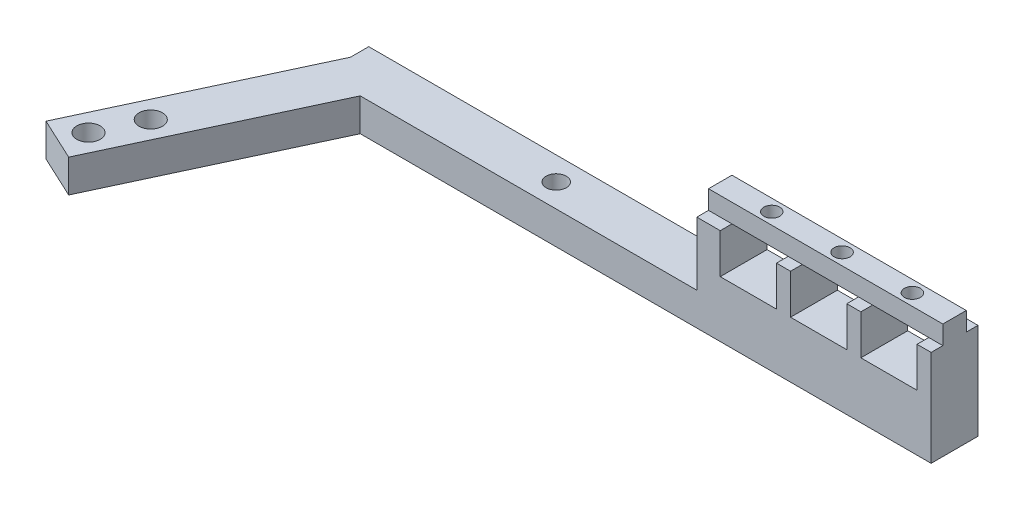
ISO-10303-21;
HEADER;
FILE_DESCRIPTION(('STEP AP214'),'2;1');
FILE_NAME('part.step','',(''),(''),'','','');
FILE_SCHEMA(('AUTOMOTIVE_DESIGN { 1 0 10303 214 1 1 1 1 }'));
ENDSEC;
DATA;
#1=APPLICATION_CONTEXT('core data for automotive mechanical design processes');
#2=APPLICATION_PROTOCOL_DEFINITION('international standard','automotive_design',2000,#1);
#3=PRODUCT_CONTEXT('',#1,'mechanical');
#4=PRODUCT('Part','Part','',(#3));
#5=PRODUCT_RELATED_PRODUCT_CATEGORY('part','',(#4));
#6=PRODUCT_DEFINITION_FORMATION('','',#4);
#7=PRODUCT_DEFINITION_CONTEXT('part definition',#1,'design');
#8=PRODUCT_DEFINITION('design','',#6,#7);
#9=PRODUCT_DEFINITION_SHAPE('','',#8);
#10=(LENGTH_UNIT() NAMED_UNIT(*) SI_UNIT(.MILLI.,.METRE.));
#11=(NAMED_UNIT(*) PLANE_ANGLE_UNIT() SI_UNIT($,.RADIAN.));
#12=(NAMED_UNIT(*) SI_UNIT($,.STERADIAN.) SOLID_ANGLE_UNIT());
#13=UNCERTAINTY_MEASURE_WITH_UNIT(LENGTH_MEASURE(1.E-05),#10,'distance_accuracy_value','');
#14=(GEOMETRIC_REPRESENTATION_CONTEXT(3) GLOBAL_UNCERTAINTY_ASSIGNED_CONTEXT((#13)) GLOBAL_UNIT_ASSIGNED_CONTEXT((#10,
#11,#12)) REPRESENTATION_CONTEXT('',''));
#15=CARTESIAN_POINT('',(0.,0.,0.));
#16=DIRECTION('',(0.,0.,1.));
#17=DIRECTION('',(1.,0.,0.));
#18=AXIS2_PLACEMENT_3D('',#15,#16,#17);
#19=CARTESIAN_POINT('',(0.,7.,10.));
#20=DIRECTION('',(0.,0.,-1.));
#21=DIRECTION('',(-1.,0.,0.));
#22=AXIS2_PLACEMENT_3D('',#19,#20,#21);
#23=PLANE('',#22);
#24=DIRECTION('',(1.,0.,0.));
#25=VECTOR('',#24,1.);
#26=CARTESIAN_POINT('',(0.,7.,10.));
#27=LINE('',#26,#25);
#28=CARTESIAN_POINT('',(8.18535130403744,7.,10.));
#29=VERTEX_POINT('',#28);
#30=CARTESIAN_POINT('',(80.,7.,10.));
#31=VERTEX_POINT('',#30);
#32=EDGE_CURVE('E77',#29,#31,#27,.T.);
#33=ORIENTED_EDGE('',*,*,#32,.F.);
#34=DIRECTION('',(0.,-1.,0.));
#35=VECTOR('',#34,1.);
#36=CARTESIAN_POINT('',(8.18535130403744,7.,10.));
#37=LINE('',#36,#35);
#38=CARTESIAN_POINT('',(8.18535130403744,0.,10.));
#39=VERTEX_POINT('',#38);
#40=EDGE_CURVE('E81',#29,#39,#37,.T.);
#41=ORIENTED_EDGE('',*,*,#40,.T.);
#42=DIRECTION('',(1.,0.,0.));
#43=VECTOR('',#42,1.);
#44=CARTESIAN_POINT('',(0.,0.,10.));
#45=LINE('',#44,#43);
#46=CARTESIAN_POINT('',(130.,0.,10.));
#47=VERTEX_POINT('',#46);
#48=EDGE_CURVE('E484',#39,#47,#45,.T.);
#49=ORIENTED_EDGE('',*,*,#48,.T.);
#50=DIRECTION('',(0.,-1.,0.));
#51=VECTOR('',#50,1.);
#52=CARTESIAN_POINT('',(130.,7.,10.));
#53=LINE('',#52,#51);
#54=CARTESIAN_POINT('',(130.,20.5,10.));
#55=VERTEX_POINT('',#54);
#56=EDGE_CURVE('E70',#55,#47,#53,.T.);
#57=ORIENTED_EDGE('',*,*,#56,.F.);
#58=DIRECTION('',(1.,0.,0.));
#59=VECTOR('',#58,1.);
#60=CARTESIAN_POINT('',(80.,20.5,10.));
#61=LINE('',#60,#59);
#62=CARTESIAN_POINT('',(127.,20.5,10.));
#63=VERTEX_POINT('',#62);
#64=EDGE_CURVE('E436',#63,#55,#61,.T.);
#65=ORIENTED_EDGE('',*,*,#64,.F.);
#66=DIRECTION('',(0.,1.,0.));
#67=VECTOR('',#66,1.);
#68=CARTESIAN_POINT('',(127.,0.,10.));
#69=LINE('',#68,#67);
#70=CARTESIAN_POINT('',(127.,12.,10.));
#71=VERTEX_POINT('',#70);
#72=EDGE_CURVE('E356',#71,#63,#69,.T.);
#73=ORIENTED_EDGE('',*,*,#72,.F.);
#74=DIRECTION('',(-1.,0.,0.));
#75=VECTOR('',#74,1.);
#76=CARTESIAN_POINT('',(0.,12.,10.));
#77=LINE('',#76,#75);
#78=CARTESIAN_POINT('',(115.,12.,10.));
#79=VERTEX_POINT('',#78);
#80=EDGE_CURVE('E364',#71,#79,#77,.T.);
#81=ORIENTED_EDGE('',*,*,#80,.T.);
#82=DIRECTION('',(0.,1.,0.));
#83=VECTOR('',#82,1.);
#84=CARTESIAN_POINT('',(115.,0.,10.));
#85=LINE('',#84,#83);
#86=CARTESIAN_POINT('',(115.,20.5,10.));
#87=VERTEX_POINT('',#86);
#88=EDGE_CURVE('E320',#79,#87,#85,.T.);
#89=ORIENTED_EDGE('',*,*,#88,.T.);
#90=CARTESIAN_POINT('',(112.,20.5,10.));
#91=VERTEX_POINT('',#90);
#92=EDGE_CURVE('E984',#91,#87,#61,.T.);
#93=ORIENTED_EDGE('',*,*,#92,.F.);
#94=DIRECTION('',(0.,1.,0.));
#95=VECTOR('',#94,1.);
#96=CARTESIAN_POINT('',(112.,0.,10.));
#97=LINE('',#96,#95);
#98=CARTESIAN_POINT('',(112.,12.,10.));
#99=VERTEX_POINT('',#98);
#100=EDGE_CURVE('E326',#99,#91,#97,.T.);
#101=ORIENTED_EDGE('',*,*,#100,.F.);
#102=DIRECTION('',(-1.,0.,0.));
#103=VECTOR('',#102,1.);
#104=CARTESIAN_POINT('',(0.,12.,10.));
#105=LINE('',#104,#103);
#106=CARTESIAN_POINT('',(100.,12.,10.));
#107=VERTEX_POINT('',#106);
#108=EDGE_CURVE('E335',#99,#107,#105,.T.);
#109=ORIENTED_EDGE('',*,*,#108,.T.);
#110=DIRECTION('',(0.,1.,0.));
#111=VECTOR('',#110,1.);
#112=CARTESIAN_POINT('',(100.,0.,10.));
#113=LINE('',#112,#111);
#114=CARTESIAN_POINT('',(100.,20.5,10.));
#115=VERTEX_POINT('',#114);
#116=EDGE_CURVE('E332',#107,#115,#113,.T.);
#117=ORIENTED_EDGE('',*,*,#116,.T.);
#118=CARTESIAN_POINT('',(97.,20.5,10.));
#119=VERTEX_POINT('',#118);
#120=EDGE_CURVE('E454',#119,#115,#61,.T.);
#121=ORIENTED_EDGE('',*,*,#120,.F.);
#122=DIRECTION('',(0.,1.,0.));
#123=VECTOR('',#122,1.);
#124=CARTESIAN_POINT('',(97.,0.,10.));
#125=LINE('',#124,#123);
#126=CARTESIAN_POINT('',(97.,12.,10.));
#127=VERTEX_POINT('',#126);
#128=EDGE_CURVE('E386',#127,#119,#125,.T.);
#129=ORIENTED_EDGE('',*,*,#128,.F.);
#130=DIRECTION('',(-1.,0.,0.));
#131=VECTOR('',#130,1.);
#132=CARTESIAN_POINT('',(0.,12.,10.));
#133=LINE('',#132,#131);
#134=CARTESIAN_POINT('',(85.,12.,10.));
#135=VERTEX_POINT('',#134);
#136=EDGE_CURVE('E394',#127,#135,#133,.T.);
#137=ORIENTED_EDGE('',*,*,#136,.T.);
#138=DIRECTION('',(0.,1.,0.));
#139=VECTOR('',#138,1.);
#140=CARTESIAN_POINT('',(85.,-1.24826662821612E-13,10.));
#141=LINE('',#140,#139);
#142=CARTESIAN_POINT('',(85.,20.5,10.));
#143=VERTEX_POINT('',#142);
#144=EDGE_CURVE('E382',#135,#143,#141,.T.);
#145=ORIENTED_EDGE('',*,*,#144,.T.);
#146=CARTESIAN_POINT('',(80.,20.5,10.));
#147=VERTEX_POINT('',#146);
#148=EDGE_CURVE('E442',#147,#143,#61,.T.);
#149=ORIENTED_EDGE('',*,*,#148,.F.);
#150=DIRECTION('',(0.,-1.,0.));
#151=VECTOR('',#150,1.);
#152=CARTESIAN_POINT('',(80.,45.5,10.));
#153=LINE('',#152,#151);
#154=EDGE_CURVE('E467',#147,#31,#153,.T.);
#155=ORIENTED_EDGE('',*,*,#154,.T.);
#156=EDGE_LOOP('',(#33,#41,#49,#57,#65,#73,#81,#89,#93,#101,#109,#117,#121,#129,#137,#145,#149,#155));
#157=FACE_BOUND('',#156,.T.);
#158=ADVANCED_FACE('F62',(#157),#23,.F.);
#159=CARTESIAN_POINT('',(0.,7.,0.));
#160=DIRECTION('',(0.,0.,1.));
#161=DIRECTION('',(1.,0.,0.));
#162=AXIS2_PLACEMENT_3D('',#159,#160,#161);
#163=PLANE('',#162);
#164=DIRECTION('',(0.,1.,0.));
#165=VECTOR('',#164,1.);
#166=CARTESIAN_POINT('',(100.,0.,0.));
#167=LINE('',#166,#165);
#168=CARTESIAN_POINT('',(100.,12.,0.));
#169=VERTEX_POINT('',#168);
#170=CARTESIAN_POINT('',(100.,20.5,0.));
#171=VERTEX_POINT('',#170);
#172=EDGE_CURVE('E323',#169,#171,#167,.T.);
#173=ORIENTED_EDGE('',*,*,#172,.F.);
#174=DIRECTION('',(-1.,0.,0.));
#175=VECTOR('',#174,1.);
#176=CARTESIAN_POINT('',(0.,12.,0.));
#177=LINE('',#176,#175);
#178=CARTESIAN_POINT('',(112.,12.,0.));
#179=VERTEX_POINT('',#178);
#180=EDGE_CURVE('E325',#179,#169,#177,.T.);
#181=ORIENTED_EDGE('',*,*,#180,.F.);
#182=DIRECTION('',(0.,1.,0.));
#183=VECTOR('',#182,1.);
#184=CARTESIAN_POINT('',(112.,0.,0.));
#185=LINE('',#184,#183);
#186=CARTESIAN_POINT('',(112.,20.5,0.));
#187=VERTEX_POINT('',#186);
#188=EDGE_CURVE('E328',#179,#187,#185,.T.);
#189=ORIENTED_EDGE('',*,*,#188,.T.);
#190=DIRECTION('',(-1.,0.,0.));
#191=VECTOR('',#190,1.);
#192=CARTESIAN_POINT('',(130.,20.5,0.));
#193=LINE('',#192,#191);
#194=CARTESIAN_POINT('',(115.,20.5,0.));
#195=VERTEX_POINT('',#194);
#196=EDGE_CURVE('E431',#195,#187,#193,.T.);
#197=ORIENTED_EDGE('',*,*,#196,.F.);
#198=DIRECTION('',(0.,1.,0.));
#199=VECTOR('',#198,1.);
#200=CARTESIAN_POINT('',(115.,0.,0.));
#201=LINE('',#200,#199);
#202=CARTESIAN_POINT('',(115.,12.,0.));
#203=VERTEX_POINT('',#202);
#204=EDGE_CURVE('E353',#203,#195,#201,.T.);
#205=ORIENTED_EDGE('',*,*,#204,.F.);
#206=DIRECTION('',(-1.,0.,0.));
#207=VECTOR('',#206,1.);
#208=CARTESIAN_POINT('',(0.,12.,0.));
#209=LINE('',#208,#207);
#210=CARTESIAN_POINT('',(127.,12.,0.));
#211=VERTEX_POINT('',#210);
#212=EDGE_CURVE('E355',#211,#203,#209,.T.);
#213=ORIENTED_EDGE('',*,*,#212,.F.);
#214=DIRECTION('',(0.,1.,0.));
#215=VECTOR('',#214,1.);
#216=CARTESIAN_POINT('',(127.,0.,0.));
#217=LINE('',#216,#215);
#218=CARTESIAN_POINT('',(127.,20.5,0.));
#219=VERTEX_POINT('',#218);
#220=EDGE_CURVE('E358',#211,#219,#217,.T.);
#221=ORIENTED_EDGE('',*,*,#220,.T.);
#222=CARTESIAN_POINT('',(130.,20.5,0.));
#223=VERTEX_POINT('',#222);
#224=EDGE_CURVE('E417',#223,#219,#193,.T.);
#225=ORIENTED_EDGE('',*,*,#224,.F.);
#226=DIRECTION('',(0.,-1.,0.));
#227=VECTOR('',#226,1.);
#228=CARTESIAN_POINT('',(130.,7.,0.));
#229=LINE('',#228,#227);
#230=CARTESIAN_POINT('',(130.,0.,0.));
#231=VERTEX_POINT('',#230);
#232=EDGE_CURVE('E492',#223,#231,#229,.T.);
#233=ORIENTED_EDGE('',*,*,#232,.T.);
#234=DIRECTION('',(-1.,0.,0.));
#235=VECTOR('',#234,1.);
#236=CARTESIAN_POINT('',(0.,0.,0.));
#237=LINE('',#236,#235);
#238=CARTESIAN_POINT('',(0.,0.,0.));
#239=VERTEX_POINT('',#238);
#240=EDGE_CURVE('E478',#231,#239,#237,.T.);
#241=ORIENTED_EDGE('',*,*,#240,.T.);
#242=DIRECTION('',(0.,-1.,0.));
#243=VECTOR('',#242,1.);
#244=CARTESIAN_POINT('',(0.,7.,0.));
#245=LINE('',#244,#243);
#246=CARTESIAN_POINT('',(0.,7.,0.));
#247=VERTEX_POINT('',#246);
#248=EDGE_CURVE('E482',#247,#239,#245,.T.);
#249=ORIENTED_EDGE('',*,*,#248,.F.);
#250=DIRECTION('',(-1.,0.,0.));
#251=VECTOR('',#250,1.);
#252=CARTESIAN_POINT('',(0.,7.,0.));
#253=LINE('',#252,#251);
#254=CARTESIAN_POINT('',(80.,7.,0.));
#255=VERTEX_POINT('',#254);
#256=EDGE_CURVE('E480',#255,#247,#253,.T.);
#257=ORIENTED_EDGE('',*,*,#256,.F.);
#258=DIRECTION('',(0.,-1.,0.));
#259=VECTOR('',#258,1.);
#260=CARTESIAN_POINT('',(80.,45.5,0.));
#261=LINE('',#260,#259);
#262=CARTESIAN_POINT('',(80.,20.5,0.));
#263=VERTEX_POINT('',#262);
#264=EDGE_CURVE('E465',#263,#255,#261,.T.);
#265=ORIENTED_EDGE('',*,*,#264,.F.);
#266=CARTESIAN_POINT('',(85.,20.5,0.));
#267=VERTEX_POINT('',#266);
#268=EDGE_CURVE('E412',#267,#263,#193,.T.);
#269=ORIENTED_EDGE('',*,*,#268,.F.);
#270=DIRECTION('',(0.,1.,0.));
#271=VECTOR('',#270,1.);
#272=CARTESIAN_POINT('',(85.,-1.24826662821612E-13,0.));
#273=LINE('',#272,#271);
#274=CARTESIAN_POINT('',(85.,12.,0.));
#275=VERTEX_POINT('',#274);
#276=EDGE_CURVE('E383',#275,#267,#273,.T.);
#277=ORIENTED_EDGE('',*,*,#276,.F.);
#278=DIRECTION('',(-1.,0.,0.));
#279=VECTOR('',#278,1.);
#280=CARTESIAN_POINT('',(0.,12.,0.));
#281=LINE('',#280,#279);
#282=CARTESIAN_POINT('',(97.,12.,0.));
#283=VERTEX_POINT('',#282);
#284=EDGE_CURVE('E385',#283,#275,#281,.T.);
#285=ORIENTED_EDGE('',*,*,#284,.F.);
#286=DIRECTION('',(0.,1.,0.));
#287=VECTOR('',#286,1.);
#288=CARTESIAN_POINT('',(97.,0.,0.));
#289=LINE('',#288,#287);
#290=CARTESIAN_POINT('',(97.,20.5,0.));
#291=VERTEX_POINT('',#290);
#292=EDGE_CURVE('E388',#283,#291,#289,.T.);
#293=ORIENTED_EDGE('',*,*,#292,.T.);
#294=EDGE_CURVE('E432',#171,#291,#193,.T.);
#295=ORIENTED_EDGE('',*,*,#294,.F.);
#296=EDGE_LOOP('',(#173,#181,#189,#197,#205,#213,#221,#225,#233,#241,#249,#257,#265,#269,#277,
#285,#293,#295));
#297=FACE_BOUND('',#296,.T.);
#298=ADVANCED_FACE('F509',(#297),#163,.F.);
#299=CARTESIAN_POINT('',(80.,20.5,7.5));
#300=DIRECTION('',(0.,-1.,0.));
#301=DIRECTION('',(0.,0.,-1.));
#302=AXIS2_PLACEMENT_3D('',#299,#300,#301);
#303=PLANE('',#302);
#304=DIRECTION('',(0.,0.,1.));
#305=VECTOR('',#304,1.);
#306=CARTESIAN_POINT('',(100.,20.5,0.));
#307=LINE('',#306,#305);
#308=CARTESIAN_POINT('',(100.,20.5,7.5));
#309=VERTEX_POINT('',#308);
#310=EDGE_CURVE('E344',#309,#115,#307,.T.);
#311=ORIENTED_EDGE('',*,*,#310,.F.);
#312=DIRECTION('',(1.,0.,0.));
#313=VECTOR('',#312,1.);
#314=CARTESIAN_POINT('',(80.,20.5,7.5));
#315=LINE('',#314,#313);
#316=CARTESIAN_POINT('',(97.,20.5,7.5));
#317=VERTEX_POINT('',#316);
#318=EDGE_CURVE('E447',#317,#309,#315,.T.);
#319=ORIENTED_EDGE('',*,*,#318,.F.);
#320=DIRECTION('',(0.,0.,1.));
#321=VECTOR('',#320,1.);
#322=CARTESIAN_POINT('',(97.,20.5,0.));
#323=LINE('',#322,#321);
#324=EDGE_CURVE('E407',#317,#119,#323,.T.);
#325=ORIENTED_EDGE('',*,*,#324,.T.);
#326=ORIENTED_EDGE('',*,*,#120,.T.);
#327=EDGE_LOOP('',(#311,#319,#325,#326));
#328=FACE_BOUND('',#327,.T.);
#329=ADVANCED_FACE('F534',(#328),#303,.F.);
#330=CARTESIAN_POINT('',(112.,20.5,7.5));
#331=VERTEX_POINT('',#330);
#332=CARTESIAN_POINT('',(115.,20.5,7.5));
#333=VERTEX_POINT('',#332);
#334=EDGE_CURVE('E932',#331,#333,#315,.T.);
#335=ORIENTED_EDGE('',*,*,#334,.F.);
#336=DIRECTION('',(0.,0.,1.));
#337=VECTOR('',#336,1.);
#338=CARTESIAN_POINT('',(112.,20.5,0.));
#339=LINE('',#338,#337);
#340=EDGE_CURVE('E349',#331,#91,#339,.T.);
#341=ORIENTED_EDGE('',*,*,#340,.T.);
#342=ORIENTED_EDGE('',*,*,#92,.T.);
#343=DIRECTION('',(0.,0.,1.));
#344=VECTOR('',#343,1.);
#345=CARTESIAN_POINT('',(115.,20.5,0.));
#346=LINE('',#345,#344);
#347=EDGE_CURVE('E370',#333,#87,#346,.T.);
#348=ORIENTED_EDGE('',*,*,#347,.F.);
#349=EDGE_LOOP('',(#335,#341,#342,#348));
#350=FACE_BOUND('',#349,.T.);
#351=ADVANCED_FACE('F856',(#350),#303,.F.);
#352=CARTESIAN_POINT('',(130.,20.5,2.5));
#353=DIRECTION('',(0.,-1.,0.));
#354=DIRECTION('',(0.,0.,-1.));
#355=AXIS2_PLACEMENT_3D('',#352,#353,#354);
#356=PLANE('',#355);
#357=CARTESIAN_POINT('',(100.,20.5,2.5));
#358=VERTEX_POINT('',#357);
#359=EDGE_CURVE('E340',#171,#358,#307,.T.);
#360=ORIENTED_EDGE('',*,*,#359,.F.);
#361=ORIENTED_EDGE('',*,*,#294,.T.);
#362=CARTESIAN_POINT('',(97.,20.5,2.5));
#363=VERTEX_POINT('',#362);
#364=EDGE_CURVE('E403',#291,#363,#323,.T.);
#365=ORIENTED_EDGE('',*,*,#364,.T.);
#366=DIRECTION('',(-1.,0.,0.));
#367=VECTOR('',#366,1.);
#368=CARTESIAN_POINT('',(130.,20.5,2.5));
#369=LINE('',#368,#367);
#370=EDGE_CURVE('E423',#358,#363,#369,.T.);
#371=ORIENTED_EDGE('',*,*,#370,.F.);
#372=EDGE_LOOP('',(#360,#361,#365,#371));
#373=FACE_BOUND('',#372,.T.);
#374=ADVANCED_FACE('F572',(#373),#356,.F.);
#375=ORIENTED_EDGE('',*,*,#196,.T.);
#376=CARTESIAN_POINT('',(112.,20.5,2.5));
#377=VERTEX_POINT('',#376);
#378=EDGE_CURVE('E345',#187,#377,#339,.T.);
#379=ORIENTED_EDGE('',*,*,#378,.T.);
#380=CARTESIAN_POINT('',(115.,20.5,2.5));
#381=VERTEX_POINT('',#380);
#382=EDGE_CURVE('E968',#381,#377,#369,.T.);
#383=ORIENTED_EDGE('',*,*,#382,.F.);
#384=EDGE_CURVE('E336',#195,#381,#346,.T.);
#385=ORIENTED_EDGE('',*,*,#384,.F.);
#386=EDGE_LOOP('',(#375,#379,#383,#385));
#387=FACE_BOUND('',#386,.T.);
#388=ADVANCED_FACE('F847',(#387),#356,.F.);
#389=DIRECTION('',(0.,0.,1.));
#390=VECTOR('',#389,1.);
#391=CARTESIAN_POINT('',(85.,20.5,0.));
#392=LINE('',#391,#390);
#393=CARTESIAN_POINT('',(85.,20.5,7.5));
#394=VERTEX_POINT('',#393);
#395=EDGE_CURVE('E402',#394,#143,#392,.T.);
#396=ORIENTED_EDGE('',*,*,#395,.F.);
#397=CARTESIAN_POINT('',(80.,20.5,7.5));
#398=VERTEX_POINT('',#397);
#399=EDGE_CURVE('E443',#398,#394,#315,.T.);
#400=ORIENTED_EDGE('',*,*,#399,.F.);
#401=DIRECTION('',(0.,0.,1.));
#402=VECTOR('',#401,1.);
#403=CARTESIAN_POINT('',(80.,20.5,7.5));
#404=LINE('',#403,#402);
#405=EDGE_CURVE('E451',#398,#147,#404,.T.);
#406=ORIENTED_EDGE('',*,*,#405,.T.);
#407=ORIENTED_EDGE('',*,*,#148,.T.);
#408=EDGE_LOOP('',(#396,#400,#406,#407));
#409=FACE_BOUND('',#408,.T.);
#410=ADVANCED_FACE('F563',(#409),#303,.F.);
#411=CARTESIAN_POINT('',(85.,20.5,2.5));
#412=VERTEX_POINT('',#411);
#413=EDGE_CURVE('E398',#267,#412,#392,.T.);
#414=ORIENTED_EDGE('',*,*,#413,.F.);
#415=ORIENTED_EDGE('',*,*,#268,.T.);
#416=DIRECTION('',(0.,0.,-1.));
#417=VECTOR('',#416,1.);
#418=CARTESIAN_POINT('',(80.,20.5,2.5));
#419=LINE('',#418,#417);
#420=CARTESIAN_POINT('',(80.,20.5,2.5));
#421=VERTEX_POINT('',#420);
#422=EDGE_CURVE('E433',#421,#263,#419,.T.);
#423=ORIENTED_EDGE('',*,*,#422,.F.);
#424=EDGE_CURVE('E416',#412,#421,#369,.T.);
#425=ORIENTED_EDGE('',*,*,#424,.F.);
#426=EDGE_LOOP('',(#414,#415,#423,#425));
#427=FACE_BOUND('',#426,.T.);
#428=ADVANCED_FACE('F557',(#427),#356,.F.);
#429=CARTESIAN_POINT('',(0.,24.5,10.));
#430=DIRECTION('',(0.,-1.,0.));
#431=DIRECTION('',(0.,0.,-1.));
#432=AXIS2_PLACEMENT_3D('',#429,#430,#431);
#433=PLANE('',#432);
#434=CARTESIAN_POINT('',(106.,24.5,5.));
#435=DIRECTION('',(0.,-1.,0.));
#436=DIRECTION('',(0.,0.,-1.));
#437=AXIS2_PLACEMENT_3D('',#434,#435,#436);
#438=CIRCLE('',#437,1.7);
#439=CARTESIAN_POINT('',(106.,24.5,3.3));
#440=VERTEX_POINT('',#439);
#441=EDGE_CURVE('E305',#440,#440,#438,.T.);
#442=ORIENTED_EDGE('',*,*,#441,.T.);
#443=EDGE_LOOP('',(#442));
#444=FACE_BOUND('',#443,.T.);
#445=CARTESIAN_POINT('',(91.,24.5,5.));
#446=DIRECTION('',(0.,-1.,0.));
#447=DIRECTION('',(0.,0.,-1.));
#448=AXIS2_PLACEMENT_3D('',#445,#446,#447);
#449=CIRCLE('',#448,1.7);
#450=CARTESIAN_POINT('',(91.,24.5,3.3));
#451=VERTEX_POINT('',#450);
#452=EDGE_CURVE('E312',#451,#451,#449,.T.);
#453=ORIENTED_EDGE('',*,*,#452,.T.);
#454=EDGE_LOOP('',(#453));
#455=FACE_BOUND('',#454,.T.);
#456=CARTESIAN_POINT('',(121.,24.5,5.));
#457=DIRECTION('',(0.,-1.,0.));
#458=DIRECTION('',(0.,0.,-1.));
#459=AXIS2_PLACEMENT_3D('',#456,#457,#458);
#460=CIRCLE('',#459,1.7);
#461=CARTESIAN_POINT('',(121.,24.5,3.3));
#462=VERTEX_POINT('',#461);
#463=EDGE_CURVE('E317',#462,#462,#460,.T.);
#464=ORIENTED_EDGE('',*,*,#463,.T.);
#465=EDGE_LOOP('',(#464));
#466=FACE_BOUND('',#465,.T.);
#467=DIRECTION('',(1.,0.,0.));
#468=VECTOR('',#467,1.);
#469=CARTESIAN_POINT('',(130.,24.5,2.5));
#470=LINE('',#469,#468);
#471=CARTESIAN_POINT('',(80.,24.5,2.5));
#472=VERTEX_POINT('',#471);
#473=CARTESIAN_POINT('',(130.,24.5,2.5));
#474=VERTEX_POINT('',#473);
#475=EDGE_CURVE('E426',#472,#474,#470,.T.);
#476=ORIENTED_EDGE('',*,*,#475,.F.);
#477=DIRECTION('',(0.,0.,-1.));
#478=VECTOR('',#477,1.);
#479=CARTESIAN_POINT('',(80.,24.5,10.));
#480=LINE('',#479,#478);
#481=CARTESIAN_POINT('',(80.,24.5,7.5));
#482=VERTEX_POINT('',#481);
#483=EDGE_CURVE('E12',#482,#472,#480,.T.);
#484=ORIENTED_EDGE('',*,*,#483,.F.);
#485=DIRECTION('',(-1.,0.,0.));
#486=VECTOR('',#485,1.);
#487=CARTESIAN_POINT('',(80.,24.5,7.5));
#488=LINE('',#487,#486);
#489=CARTESIAN_POINT('',(130.,24.5,7.5));
#490=VERTEX_POINT('',#489);
#491=EDGE_CURVE('E449',#490,#482,#488,.T.);
#492=ORIENTED_EDGE('',*,*,#491,.F.);
#493=DIRECTION('',(0.,0.,-1.));
#494=VECTOR('',#493,1.);
#495=CARTESIAN_POINT('',(130.,24.5,10.));
#496=LINE('',#495,#494);
#497=EDGE_CURVE('E458',#490,#474,#496,.T.);
#498=ORIENTED_EDGE('',*,*,#497,.T.);
#499=EDGE_LOOP('',(#476,#484,#492,#498));
#500=FACE_BOUND('',#499,.T.);
#501=ADVANCED_FACE('F545',(#444,#455,#466,#500),#433,.F.);
#502=CARTESIAN_POINT('',(0.,7.,0.));
#503=DIRECTION('',(0.,1.,0.));
#504=DIRECTION('',(0.,0.,1.));
#505=AXIS2_PLACEMENT_3D('',#502,#503,#504);
#506=PLANE('',#505);
#507=CARTESIAN_POINT('',(-9.79163916092465,7.,36.7207725462827));
#508=DIRECTION('',(0.,-1.,0.));
#509=DIRECTION('',(0.,0.,-1.));
#510=AXIS2_PLACEMENT_3D('',#507,#508,#509);
#511=CIRCLE('',#510,2.5);
#512=CARTESIAN_POINT('',(-9.79163916092465,7.,34.2207725462827));
#513=VERTEX_POINT('',#512);
#514=EDGE_CURVE('E649',#513,#513,#511,.T.);
#515=ORIENTED_EDGE('',*,*,#514,.T.);
#516=EDGE_LOOP('',(#515));
#517=FACE_BOUND('',#516,.T.);
#518=CARTESIAN_POINT('',(-14.0178217783317,7.,45.7838504166491));
#519=DIRECTION('',(0.,-1.,0.));
#520=DIRECTION('',(0.,0.,-1.));
#521=AXIS2_PLACEMENT_3D('',#518,#519,#520);
#522=CIRCLE('',#521,2.5);
#523=CARTESIAN_POINT('',(-14.0178217783317,7.,43.2838504166491));
#524=VERTEX_POINT('',#523);
#525=EDGE_CURVE('E297',#524,#524,#522,.T.);
#526=ORIENTED_EDGE('',*,*,#525,.T.);
#527=EDGE_LOOP('',(#526));
#528=FACE_BOUND('',#527,.T.);
#529=DIRECTION('',(-0.422618261740704,0.,0.906307787036648));
#530=VECTOR('',#529,1.);
#531=CARTESIAN_POINT('',(10.553619067197,7.,4.92123339228466));
#532=LINE('',#531,#530);
#533=CARTESIAN_POINT('',(-11.599374151852,7.,52.4284806605359));
#534=VERTEX_POINT('',#533);
#535=EDGE_CURVE('E269',#29,#534,#532,.T.);
#536=ORIENTED_EDGE('',*,*,#535,.F.);
#537=ORIENTED_EDGE('',*,*,#32,.T.);
#538=DIRECTION('',(0.,0.,1.));
#539=VECTOR('',#538,1.);
#540=CARTESIAN_POINT('',(80.,7.,10.));
#541=LINE('',#540,#539);
#542=EDGE_CURVE('E462',#255,#31,#541,.T.);
#543=ORIENTED_EDGE('',*,*,#542,.F.);
#544=ORIENTED_EDGE('',*,*,#256,.T.);
#545=DIRECTION('',(0.,0.,1.));
#546=VECTOR('',#545,1.);
#547=CARTESIAN_POINT('',(0.,7.,0.));
#548=LINE('',#547,#546);
#549=CARTESIAN_POINT('',(0.,7.,3.89152668678525));
#550=VERTEX_POINT('',#549);
#551=EDGE_CURVE('E476',#247,#550,#548,.T.);
#552=ORIENTED_EDGE('',*,*,#551,.T.);
#553=DIRECTION('',(0.422618261740704,0.,-0.906307787036648));
#554=VECTOR('',#553,1.);
#555=CARTESIAN_POINT('',(1.49054119683054,7.,0.695050774877606));
#556=LINE('',#555,#554);
#557=CARTESIAN_POINT('',(-20.6624520222184,7.,48.2022980431289));
#558=VERTEX_POINT('',#557);
#559=EDGE_CURVE('E272',#558,#550,#556,.T.);
#560=ORIENTED_EDGE('',*,*,#559,.F.);
#561=DIRECTION('',(0.90630778703665,0.,0.422618261740701));
#562=VECTOR('',#561,1.);
#563=CARTESIAN_POINT('',(-22.1529932190488,7.,47.5072472682514));
#564=LINE('',#563,#562);
#565=EDGE_CURVE('E264',#558,#534,#564,.T.);
#566=ORIENTED_EDGE('',*,*,#565,.T.);
#567=EDGE_LOOP('',(#536,#537,#543,#544,#552,#560,#566));
#568=FACE_BOUND('',#567,.T.);
#569=CARTESIAN_POINT('',(45.,7.,5.));
#570=DIRECTION('',(0.,1.,0.));
#571=DIRECTION('',(0.,0.,1.));
#572=AXIS2_PLACEMENT_3D('',#569,#570,#571);
#573=CIRCLE('',#572,2.15);
#574=CARTESIAN_POINT('',(45.,7.,7.15));
#575=VERTEX_POINT('',#574);
#576=EDGE_CURVE('E470',#575,#575,#573,.T.);
#577=ORIENTED_EDGE('',*,*,#576,.F.);
#578=EDGE_LOOP('',(#577));
#579=FACE_BOUND('',#578,.T.);
#580=ADVANCED_FACE('F266',(#517,#528,#568,#579),#506,.T.);
#581=CARTESIAN_POINT('',(0.,0.,0.));
#582=DIRECTION('',(0.,1.,0.));
#583=DIRECTION('',(0.,0.,1.));
#584=AXIS2_PLACEMENT_3D('',#581,#582,#583);
#585=PLANE('',#584);
#586=CARTESIAN_POINT('',(-9.79163916092465,0.,36.7207725462827));
#587=DIRECTION('',(0.,-1.,0.));
#588=DIRECTION('',(0.,0.,-1.));
#589=AXIS2_PLACEMENT_3D('',#586,#587,#588);
#590=CIRCLE('',#589,2.5);
#591=CARTESIAN_POINT('',(-9.79163916092465,0.,34.2207725462827));
#592=VERTEX_POINT('',#591);
#593=EDGE_CURVE('E651',#592,#592,#590,.T.);
#594=ORIENTED_EDGE('',*,*,#593,.F.);
#595=EDGE_LOOP('',(#594));
#596=FACE_BOUND('',#595,.T.);
#597=CARTESIAN_POINT('',(-14.0178217783317,0.,45.7838504166491));
#598=DIRECTION('',(0.,-1.,0.));
#599=DIRECTION('',(0.,0.,-1.));
#600=AXIS2_PLACEMENT_3D('',#597,#598,#599);
#601=CIRCLE('',#600,2.5);
#602=CARTESIAN_POINT('',(-14.0178217783317,0.,43.2838504166491));
#603=VERTEX_POINT('',#602);
#604=EDGE_CURVE('E291',#603,#603,#601,.T.);
#605=ORIENTED_EDGE('',*,*,#604,.F.);
#606=EDGE_LOOP('',(#605));
#607=FACE_BOUND('',#606,.T.);
#608=CARTESIAN_POINT('',(45.,0.,5.));
#609=DIRECTION('',(0.,1.,0.));
#610=DIRECTION('',(0.,0.,1.));
#611=AXIS2_PLACEMENT_3D('',#608,#609,#610);
#612=CIRCLE('',#611,2.15);
#613=CARTESIAN_POINT('',(45.,0.,7.15));
#614=VERTEX_POINT('',#613);
#615=EDGE_CURVE('E469',#614,#614,#612,.T.);
#616=ORIENTED_EDGE('',*,*,#615,.T.);
#617=EDGE_LOOP('',(#616));
#618=FACE_BOUND('',#617,.T.);
#619=ORIENTED_EDGE('',*,*,#48,.F.);
#620=DIRECTION('',(-0.422618261740704,0.,0.906307787036648));
#621=VECTOR('',#620,1.);
#622=CARTESIAN_POINT('',(10.553619067197,0.,4.92123339228466));
#623=LINE('',#622,#621);
#624=CARTESIAN_POINT('',(-11.599374151852,0.,52.4284806605359));
#625=VERTEX_POINT('',#624);
#626=EDGE_CURVE('E295',#39,#625,#623,.T.);
#627=ORIENTED_EDGE('',*,*,#626,.T.);
#628=DIRECTION('',(0.90630778703665,0.,0.422618261740701));
#629=VECTOR('',#628,1.);
#630=CARTESIAN_POINT('',(-22.1529932190488,0.,47.5072472682514));
#631=LINE('',#630,#629);
#632=CARTESIAN_POINT('',(-20.6624520222184,0.,48.2022980431289));
#633=VERTEX_POINT('',#632);
#634=EDGE_CURVE('E279',#633,#625,#631,.T.);
#635=ORIENTED_EDGE('',*,*,#634,.F.);
#636=DIRECTION('',(0.422618261740704,0.,-0.906307787036648));
#637=VECTOR('',#636,1.);
#638=CARTESIAN_POINT('',(1.49054119683054,0.,0.695050774877606));
#639=LINE('',#638,#637);
#640=CARTESIAN_POINT('',(0.,0.,3.89152668678525));
#641=VERTEX_POINT('',#640);
#642=EDGE_CURVE('E286',#633,#641,#639,.T.);
#643=ORIENTED_EDGE('',*,*,#642,.T.);
#644=DIRECTION('',(0.,0.,1.));
#645=VECTOR('',#644,1.);
#646=CARTESIAN_POINT('',(0.,0.,0.));
#647=LINE('',#646,#645);
#648=EDGE_CURVE('E473',#239,#641,#647,.T.);
#649=ORIENTED_EDGE('',*,*,#648,.F.);
#650=ORIENTED_EDGE('',*,*,#240,.F.);
#651=DIRECTION('',(0.,0.,-1.));
#652=VECTOR('',#651,1.);
#653=CARTESIAN_POINT('',(130.,0.,0.));
#654=LINE('',#653,#652);
#655=EDGE_CURVE('E486',#47,#231,#654,.T.);
#656=ORIENTED_EDGE('',*,*,#655,.F.);
#657=EDGE_LOOP('',(#619,#627,#635,#643,#649,#650,#656));
#658=FACE_BOUND('',#657,.T.);
#659=ADVANCED_FACE('F504',(#596,#607,#618,#658),#585,.F.);
#660=CARTESIAN_POINT('',(0.,7.,0.));
#661=DIRECTION('',(1.,0.,0.));
#662=DIRECTION('',(0.,0.,-1.));
#663=AXIS2_PLACEMENT_3D('',#660,#661,#662);
#664=PLANE('',#663);
#665=ORIENTED_EDGE('',*,*,#648,.T.);
#666=DIRECTION('',(0.,-1.,0.));
#667=VECTOR('',#666,1.);
#668=CARTESIAN_POINT('',(0.,7.,3.89152668678525));
#669=LINE('',#668,#667);
#670=EDGE_CURVE('E299',#550,#641,#669,.T.);
#671=ORIENTED_EDGE('',*,*,#670,.F.);
#672=ORIENTED_EDGE('',*,*,#551,.F.);
#673=ORIENTED_EDGE('',*,*,#248,.T.);
#674=EDGE_LOOP('',(#665,#671,#672,#673));
#675=FACE_BOUND('',#674,.T.);
#676=ADVANCED_FACE('F64',(#675),#664,.F.);
#677=CARTESIAN_POINT('',(130.,7.,0.));
#678=DIRECTION('',(-1.,0.,0.));
#679=DIRECTION('',(0.,0.,1.));
#680=AXIS2_PLACEMENT_3D('',#677,#678,#679);
#681=PLANE('',#680);
#682=ORIENTED_EDGE('',*,*,#232,.F.);
#683=DIRECTION('',(0.,0.,-1.));
#684=VECTOR('',#683,1.);
#685=CARTESIAN_POINT('',(130.,20.5,2.5));
#686=LINE('',#685,#684);
#687=CARTESIAN_POINT('',(130.,20.5,2.5));
#688=VERTEX_POINT('',#687);
#689=EDGE_CURVE('E428',#688,#223,#686,.T.);
#690=ORIENTED_EDGE('',*,*,#689,.F.);
#691=DIRECTION('',(0.,-1.,0.));
#692=VECTOR('',#691,1.);
#693=CARTESIAN_POINT('',(130.,24.5,2.5));
#694=LINE('',#693,#692);
#695=EDGE_CURVE('E413',#474,#688,#694,.T.);
#696=ORIENTED_EDGE('',*,*,#695,.F.);
#697=ORIENTED_EDGE('',*,*,#497,.F.);
#698=DIRECTION('',(0.,1.,0.));
#699=VECTOR('',#698,1.);
#700=CARTESIAN_POINT('',(130.,24.5,7.5));
#701=LINE('',#700,#699);
#702=CARTESIAN_POINT('',(130.,20.5,7.5));
#703=VERTEX_POINT('',#702);
#704=EDGE_CURVE('E446',#703,#490,#701,.T.);
#705=ORIENTED_EDGE('',*,*,#704,.F.);
#706=DIRECTION('',(0.,0.,1.));
#707=VECTOR('',#706,1.);
#708=CARTESIAN_POINT('',(130.,20.5,7.5));
#709=LINE('',#708,#707);
#710=EDGE_CURVE('E455',#703,#55,#709,.T.);
#711=ORIENTED_EDGE('',*,*,#710,.T.);
#712=ORIENTED_EDGE('',*,*,#56,.T.);
#713=ORIENTED_EDGE('',*,*,#655,.T.);
#714=EDGE_LOOP('',(#682,#690,#696,#697,#705,#711,#712,#713));
#715=FACE_BOUND('',#714,.T.);
#716=ADVANCED_FACE('F498',(#715),#681,.F.);
#717=CARTESIAN_POINT('',(45.,7.,5.));
#718=DIRECTION('',(0.,-1.,0.));
#719=DIRECTION('',(0.,0.,-1.));
#720=AXIS2_PLACEMENT_3D('',#717,#718,#719);
#721=CYLINDRICAL_SURFACE('',#720,2.15);
#722=ORIENTED_EDGE('',*,*,#576,.T.);
#723=EDGE_LOOP('',(#722));
#724=FACE_BOUND('',#723,.T.);
#725=ORIENTED_EDGE('',*,*,#615,.F.);
#726=EDGE_LOOP('',(#725));
#727=FACE_BOUND('',#726,.T.);
#728=ADVANCED_FACE('F538',(#724,#727),#721,.F.);
#729=CARTESIAN_POINT('',(80.,45.5,10.));
#730=DIRECTION('',(1.,0.,0.));
#731=DIRECTION('',(0.,0.,-1.));
#732=AXIS2_PLACEMENT_3D('',#729,#730,#731);
#733=PLANE('',#732);
#734=DIRECTION('',(0.,1.,0.));
#735=VECTOR('',#734,1.);
#736=CARTESIAN_POINT('',(80.,24.5,2.5));
#737=LINE('',#736,#735);
#738=EDGE_CURVE('E421',#421,#472,#737,.T.);
#739=ORIENTED_EDGE('',*,*,#738,.F.);
#740=ORIENTED_EDGE('',*,*,#422,.T.);
#741=ORIENTED_EDGE('',*,*,#264,.T.);
#742=ORIENTED_EDGE('',*,*,#542,.T.);
#743=ORIENTED_EDGE('',*,*,#154,.F.);
#744=ORIENTED_EDGE('',*,*,#405,.F.);
#745=DIRECTION('',(0.,-1.,0.));
#746=VECTOR('',#745,1.);
#747=CARTESIAN_POINT('',(80.,24.5,7.5));
#748=LINE('',#747,#746);
#749=EDGE_CURVE('E438',#482,#398,#748,.T.);
#750=ORIENTED_EDGE('',*,*,#749,.F.);
#751=ORIENTED_EDGE('',*,*,#483,.T.);
#752=EDGE_LOOP('',(#739,#740,#741,#742,#743,#744,#750,#751));
#753=FACE_BOUND('',#752,.T.);
#754=ADVANCED_FACE('F549',(#753),#733,.F.);
#755=CARTESIAN_POINT('',(127.,20.5,7.5));
#756=VERTEX_POINT('',#755);
#757=EDGE_CURVE('E441',#756,#703,#315,.T.);
#758=ORIENTED_EDGE('',*,*,#757,.F.);
#759=DIRECTION('',(0.,0.,1.));
#760=VECTOR('',#759,1.);
#761=CARTESIAN_POINT('',(127.,20.5,0.));
#762=LINE('',#761,#760);
#763=EDGE_CURVE('E375',#756,#63,#762,.T.);
#764=ORIENTED_EDGE('',*,*,#763,.T.);
#765=ORIENTED_EDGE('',*,*,#64,.T.);
#766=ORIENTED_EDGE('',*,*,#710,.F.);
#767=EDGE_LOOP('',(#758,#764,#765,#766));
#768=FACE_BOUND('',#767,.T.);
#769=ADVANCED_FACE('F553',(#768),#303,.F.);
#770=CARTESIAN_POINT('',(0.,0.,7.5));
#771=DIRECTION('',(0.,0.,1.));
#772=DIRECTION('',(1.,0.,0.));
#773=AXIS2_PLACEMENT_3D('',#770,#771,#772);
#774=PLANE('',#773);
#775=ORIENTED_EDGE('',*,*,#749,.T.);
#776=ORIENTED_EDGE('',*,*,#399,.T.);
#777=DIRECTION('',(-1.,0.,0.));
#778=VECTOR('',#777,1.);
#779=CARTESIAN_POINT('',(0.,20.5,7.5));
#780=LINE('',#779,#778);
#781=EDGE_CURVE('E400',#317,#394,#780,.T.);
#782=ORIENTED_EDGE('',*,*,#781,.F.);
#783=ORIENTED_EDGE('',*,*,#318,.T.);
#784=DIRECTION('',(-1.,0.,0.));
#785=VECTOR('',#784,1.);
#786=CARTESIAN_POINT('',(0.,20.5,7.5));
#787=LINE('',#786,#785);
#788=EDGE_CURVE('E380',#331,#309,#787,.T.);
#789=ORIENTED_EDGE('',*,*,#788,.F.);
#790=ORIENTED_EDGE('',*,*,#334,.T.);
#791=DIRECTION('',(-1.,0.,0.));
#792=VECTOR('',#791,1.);
#793=CARTESIAN_POINT('',(0.,20.5,7.5));
#794=LINE('',#793,#792);
#795=EDGE_CURVE('E342',#756,#333,#794,.T.);
#796=ORIENTED_EDGE('',*,*,#795,.F.);
#797=ORIENTED_EDGE('',*,*,#757,.T.);
#798=ORIENTED_EDGE('',*,*,#704,.T.);
#799=ORIENTED_EDGE('',*,*,#491,.T.);
#800=EDGE_LOOP('',(#775,#776,#782,#783,#789,#790,#796,#797,#798,#799));
#801=FACE_BOUND('',#800,.T.);
#802=ADVANCED_FACE('F561',(#801),#774,.T.);
#803=ORIENTED_EDGE('',*,*,#224,.T.);
#804=CARTESIAN_POINT('',(127.,20.5,2.5));
#805=VERTEX_POINT('',#804);
#806=EDGE_CURVE('E371',#219,#805,#762,.T.);
#807=ORIENTED_EDGE('',*,*,#806,.T.);
#808=EDGE_CURVE('E418',#688,#805,#369,.T.);
#809=ORIENTED_EDGE('',*,*,#808,.F.);
#810=ORIENTED_EDGE('',*,*,#689,.T.);
#811=EDGE_LOOP('',(#803,#807,#809,#810));
#812=FACE_BOUND('',#811,.T.);
#813=ADVANCED_FACE('F566',(#812),#356,.F.);
#814=CARTESIAN_POINT('',(0.,0.,2.5));
#815=DIRECTION('',(0.,0.,-1.));
#816=DIRECTION('',(-1.,0.,0.));
#817=AXIS2_PLACEMENT_3D('',#814,#815,#816);
#818=PLANE('',#817);
#819=ORIENTED_EDGE('',*,*,#695,.T.);
#820=ORIENTED_EDGE('',*,*,#808,.T.);
#821=EDGE_CURVE('E422',#805,#381,#369,.T.);
#822=ORIENTED_EDGE('',*,*,#821,.T.);
#823=ORIENTED_EDGE('',*,*,#382,.T.);
#824=EDGE_CURVE('E967',#377,#358,#369,.T.);
#825=ORIENTED_EDGE('',*,*,#824,.T.);
#826=ORIENTED_EDGE('',*,*,#370,.T.);
#827=EDGE_CURVE('E424',#363,#412,#369,.T.);
#828=ORIENTED_EDGE('',*,*,#827,.T.);
#829=ORIENTED_EDGE('',*,*,#424,.T.);
#830=ORIENTED_EDGE('',*,*,#738,.T.);
#831=ORIENTED_EDGE('',*,*,#475,.T.);
#832=EDGE_LOOP('',(#819,#820,#822,#823,#825,#826,#828,#829,#830,#831));
#833=FACE_BOUND('',#832,.T.);
#834=ADVANCED_FACE('F570',(#833),#818,.T.);
#835=CARTESIAN_POINT('',(85.,-1.24826662821612E-13,0.));
#836=DIRECTION('',(1.,0.,0.));
#837=DIRECTION('',(0.,1.,0.));
#838=AXIS2_PLACEMENT_3D('',#835,#836,#837);
#839=PLANE('',#838);
#840=ORIENTED_EDGE('',*,*,#144,.F.);
#841=DIRECTION('',(0.,0.,1.));
#842=VECTOR('',#841,1.);
#843=CARTESIAN_POINT('',(85.,12.,0.));
#844=LINE('',#843,#842);
#845=EDGE_CURVE('E391',#275,#135,#844,.T.);
#846=ORIENTED_EDGE('',*,*,#845,.F.);
#847=ORIENTED_EDGE('',*,*,#276,.T.);
#848=ORIENTED_EDGE('',*,*,#413,.T.);
#849=EDGE_CURVE('E401',#412,#394,#392,.T.);
#850=ORIENTED_EDGE('',*,*,#849,.T.);
#851=ORIENTED_EDGE('',*,*,#395,.T.);
#852=EDGE_LOOP('',(#840,#846,#847,#848,#850,#851));
#853=FACE_BOUND('',#852,.T.);
#854=ADVANCED_FACE('F575',(#853),#839,.T.);
#855=CARTESIAN_POINT('',(0.,20.5,0.));
#856=DIRECTION('',(0.,1.,0.));
#857=DIRECTION('',(0.,0.,1.));
#858=AXIS2_PLACEMENT_3D('',#855,#856,#857);
#859=PLANE('',#858);
#860=CARTESIAN_POINT('',(91.,20.5,5.));
#861=DIRECTION('',(0.,-1.,0.));
#862=DIRECTION('',(0.,0.,-1.));
#863=AXIS2_PLACEMENT_3D('',#860,#861,#862);
#864=CIRCLE('',#863,1.7);
#865=CARTESIAN_POINT('',(91.,20.5,3.3));
#866=VERTEX_POINT('',#865);
#867=EDGE_CURVE('E302',#866,#866,#864,.T.);
#868=ORIENTED_EDGE('',*,*,#867,.F.);
#869=EDGE_LOOP('',(#868));
#870=FACE_BOUND('',#869,.T.);
#871=ORIENTED_EDGE('',*,*,#781,.T.);
#872=ORIENTED_EDGE('',*,*,#849,.F.);
#873=ORIENTED_EDGE('',*,*,#827,.F.);
#874=EDGE_CURVE('E406',#363,#317,#323,.T.);
#875=ORIENTED_EDGE('',*,*,#874,.T.);
#876=EDGE_LOOP('',(#871,#872,#873,#875));
#877=FACE_BOUND('',#876,.T.);
#878=ADVANCED_FACE('F579',(#870,#877),#859,.F.);
#879=CARTESIAN_POINT('',(97.,0.,0.));
#880=DIRECTION('',(1.,0.,0.));
#881=DIRECTION('',(0.,0.,-1.));
#882=AXIS2_PLACEMENT_3D('',#879,#880,#881);
#883=PLANE('',#882);
#884=ORIENTED_EDGE('',*,*,#128,.T.);
#885=ORIENTED_EDGE('',*,*,#324,.F.);
#886=ORIENTED_EDGE('',*,*,#874,.F.);
#887=ORIENTED_EDGE('',*,*,#364,.F.);
#888=ORIENTED_EDGE('',*,*,#292,.F.);
#889=DIRECTION('',(0.,0.,1.));
#890=VECTOR('',#889,1.);
#891=CARTESIAN_POINT('',(97.,12.,0.));
#892=LINE('',#891,#890);
#893=EDGE_CURVE('E408',#283,#127,#892,.T.);
#894=ORIENTED_EDGE('',*,*,#893,.T.);
#895=EDGE_LOOP('',(#884,#885,#886,#887,#888,#894));
#896=FACE_BOUND('',#895,.T.);
#897=ADVANCED_FACE('F585',(#896),#883,.F.);
#898=CARTESIAN_POINT('',(0.,12.,0.));
#899=DIRECTION('',(0.,1.,0.));
#900=DIRECTION('',(-1.,0.,0.));
#901=AXIS2_PLACEMENT_3D('',#898,#899,#900);
#902=PLANE('',#901);
#903=ORIENTED_EDGE('',*,*,#136,.F.);
#904=ORIENTED_EDGE('',*,*,#893,.F.);
#905=ORIENTED_EDGE('',*,*,#284,.T.);
#906=ORIENTED_EDGE('',*,*,#845,.T.);
#907=EDGE_LOOP('',(#903,#904,#905,#906));
#908=FACE_BOUND('',#907,.T.);
#909=ADVANCED_FACE('F581',(#908),#902,.T.);
#910=CARTESIAN_POINT('',(115.,0.,0.));
#911=DIRECTION('',(1.,0.,0.));
#912=DIRECTION('',(0.,0.,-1.));
#913=AXIS2_PLACEMENT_3D('',#910,#911,#912);
#914=PLANE('',#913);
#915=ORIENTED_EDGE('',*,*,#88,.F.);
#916=DIRECTION('',(0.,0.,1.));
#917=VECTOR('',#916,1.);
#918=CARTESIAN_POINT('',(115.,12.,0.));
#919=LINE('',#918,#917);
#920=EDGE_CURVE('E361',#203,#79,#919,.T.);
#921=ORIENTED_EDGE('',*,*,#920,.F.);
#922=ORIENTED_EDGE('',*,*,#204,.T.);
#923=ORIENTED_EDGE('',*,*,#384,.T.);
#924=EDGE_CURVE('E369',#381,#333,#346,.T.);
#925=ORIENTED_EDGE('',*,*,#924,.T.);
#926=ORIENTED_EDGE('',*,*,#347,.T.);
#927=EDGE_LOOP('',(#915,#921,#922,#923,#925,#926));
#928=FACE_BOUND('',#927,.T.);
#929=ADVANCED_FACE('F584',(#928),#914,.T.);
#930=CARTESIAN_POINT('',(0.,20.5,0.));
#931=DIRECTION('',(0.,1.,0.));
#932=DIRECTION('',(0.,0.,1.));
#933=AXIS2_PLACEMENT_3D('',#930,#931,#932);
#934=PLANE('',#933);
#935=CARTESIAN_POINT('',(121.,20.5,5.));
#936=DIRECTION('',(0.,-1.,0.));
#937=DIRECTION('',(0.,0.,-1.));
#938=AXIS2_PLACEMENT_3D('',#935,#936,#937);
#939=CIRCLE('',#938,1.7);
#940=CARTESIAN_POINT('',(121.,20.5,3.3));
#941=VERTEX_POINT('',#940);
#942=EDGE_CURVE('E308',#941,#941,#939,.T.);
#943=ORIENTED_EDGE('',*,*,#942,.F.);
#944=EDGE_LOOP('',(#943));
#945=FACE_BOUND('',#944,.T.);
#946=ORIENTED_EDGE('',*,*,#795,.T.);
#947=ORIENTED_EDGE('',*,*,#924,.F.);
#948=ORIENTED_EDGE('',*,*,#821,.F.);
#949=EDGE_CURVE('E374',#805,#756,#762,.T.);
#950=ORIENTED_EDGE('',*,*,#949,.T.);
#951=EDGE_LOOP('',(#946,#947,#948,#950));
#952=FACE_BOUND('',#951,.T.);
#953=ADVANCED_FACE('F595',(#945,#952),#934,.F.);
#954=CARTESIAN_POINT('',(127.,0.,0.));
#955=DIRECTION('',(1.,0.,0.));
#956=DIRECTION('',(0.,0.,-1.));
#957=AXIS2_PLACEMENT_3D('',#954,#955,#956);
#958=PLANE('',#957);
#959=ORIENTED_EDGE('',*,*,#72,.T.);
#960=ORIENTED_EDGE('',*,*,#763,.F.);
#961=ORIENTED_EDGE('',*,*,#949,.F.);
#962=ORIENTED_EDGE('',*,*,#806,.F.);
#963=ORIENTED_EDGE('',*,*,#220,.F.);
#964=DIRECTION('',(0.,0.,1.));
#965=VECTOR('',#964,1.);
#966=CARTESIAN_POINT('',(127.,12.,0.));
#967=LINE('',#966,#965);
#968=EDGE_CURVE('E376',#211,#71,#967,.T.);
#969=ORIENTED_EDGE('',*,*,#968,.T.);
#970=EDGE_LOOP('',(#959,#960,#961,#962,#963,#969));
#971=FACE_BOUND('',#970,.T.);
#972=ADVANCED_FACE('F601',(#971),#958,.F.);
#973=CARTESIAN_POINT('',(0.,12.,0.));
#974=DIRECTION('',(0.,1.,0.));
#975=DIRECTION('',(-1.,0.,0.));
#976=AXIS2_PLACEMENT_3D('',#973,#974,#975);
#977=PLANE('',#976);
#978=ORIENTED_EDGE('',*,*,#80,.F.);
#979=ORIENTED_EDGE('',*,*,#968,.F.);
#980=ORIENTED_EDGE('',*,*,#212,.T.);
#981=ORIENTED_EDGE('',*,*,#920,.T.);
#982=EDGE_LOOP('',(#978,#979,#980,#981));
#983=FACE_BOUND('',#982,.T.);
#984=ADVANCED_FACE('F597',(#983),#977,.T.);
#985=CARTESIAN_POINT('',(100.,0.,0.));
#986=DIRECTION('',(1.,0.,0.));
#987=DIRECTION('',(0.,0.,-1.));
#988=AXIS2_PLACEMENT_3D('',#985,#986,#987);
#989=PLANE('',#988);
#990=ORIENTED_EDGE('',*,*,#116,.F.);
#991=DIRECTION('',(0.,0.,1.));
#992=VECTOR('',#991,1.);
#993=CARTESIAN_POINT('',(100.,12.,0.));
#994=LINE('',#993,#992);
#995=EDGE_CURVE('E331',#169,#107,#994,.T.);
#996=ORIENTED_EDGE('',*,*,#995,.F.);
#997=ORIENTED_EDGE('',*,*,#172,.T.);
#998=ORIENTED_EDGE('',*,*,#359,.T.);
#999=EDGE_CURVE('E343',#358,#309,#307,.T.);
#1000=ORIENTED_EDGE('',*,*,#999,.T.);
#1001=ORIENTED_EDGE('',*,*,#310,.T.);
#1002=EDGE_LOOP('',(#990,#996,#997,#998,#1000,#1001));
#1003=FACE_BOUND('',#1002,.T.);
#1004=ADVANCED_FACE('F600',(#1003),#989,.T.);
#1005=CARTESIAN_POINT('',(0.,20.5,0.));
#1006=DIRECTION('',(0.,1.,0.));
#1007=DIRECTION('',(0.,0.,1.));
#1008=AXIS2_PLACEMENT_3D('',#1005,#1006,#1007);
#1009=PLANE('',#1008);
#1010=CARTESIAN_POINT('',(106.,20.5,5.));
#1011=DIRECTION('',(0.,-1.,0.));
#1012=DIRECTION('',(0.,0.,-1.));
#1013=AXIS2_PLACEMENT_3D('',#1010,#1011,#1012);
#1014=CIRCLE('',#1013,1.7);
#1015=CARTESIAN_POINT('',(106.,20.5,3.3));
#1016=VERTEX_POINT('',#1015);
#1017=EDGE_CURVE('E309',#1016,#1016,#1014,.T.);
#1018=ORIENTED_EDGE('',*,*,#1017,.F.);
#1019=EDGE_LOOP('',(#1018));
#1020=FACE_BOUND('',#1019,.T.);
#1021=ORIENTED_EDGE('',*,*,#788,.T.);
#1022=ORIENTED_EDGE('',*,*,#999,.F.);
#1023=ORIENTED_EDGE('',*,*,#824,.F.);
#1024=EDGE_CURVE('E348',#377,#331,#339,.T.);
#1025=ORIENTED_EDGE('',*,*,#1024,.T.);
#1026=EDGE_LOOP('',(#1021,#1022,#1023,#1025));
#1027=FACE_BOUND('',#1026,.T.);
#1028=ADVANCED_FACE('F611',(#1020,#1027),#1009,.F.);
#1029=CARTESIAN_POINT('',(112.,0.,0.));
#1030=DIRECTION('',(1.,0.,0.));
#1031=DIRECTION('',(0.,0.,-1.));
#1032=AXIS2_PLACEMENT_3D('',#1029,#1030,#1031);
#1033=PLANE('',#1032);
#1034=ORIENTED_EDGE('',*,*,#100,.T.);
#1035=ORIENTED_EDGE('',*,*,#340,.F.);
#1036=ORIENTED_EDGE('',*,*,#1024,.F.);
#1037=ORIENTED_EDGE('',*,*,#378,.F.);
#1038=ORIENTED_EDGE('',*,*,#188,.F.);
#1039=DIRECTION('',(0.,0.,1.));
#1040=VECTOR('',#1039,1.);
#1041=CARTESIAN_POINT('',(112.,12.,0.));
#1042=LINE('',#1041,#1040);
#1043=EDGE_CURVE('E350',#179,#99,#1042,.T.);
#1044=ORIENTED_EDGE('',*,*,#1043,.T.);
#1045=EDGE_LOOP('',(#1034,#1035,#1036,#1037,#1038,#1044));
#1046=FACE_BOUND('',#1045,.T.);
#1047=ADVANCED_FACE('F617',(#1046),#1033,.F.);
#1048=CARTESIAN_POINT('',(0.,12.,0.));
#1049=DIRECTION('',(0.,1.,0.));
#1050=DIRECTION('',(-1.,0.,0.));
#1051=AXIS2_PLACEMENT_3D('',#1048,#1049,#1050);
#1052=PLANE('',#1051);
#1053=ORIENTED_EDGE('',*,*,#108,.F.);
#1054=ORIENTED_EDGE('',*,*,#1043,.F.);
#1055=ORIENTED_EDGE('',*,*,#180,.T.);
#1056=ORIENTED_EDGE('',*,*,#995,.T.);
#1057=EDGE_LOOP('',(#1053,#1054,#1055,#1056));
#1058=FACE_BOUND('',#1057,.T.);
#1059=ADVANCED_FACE('F613',(#1058),#1052,.T.);
#1060=CARTESIAN_POINT('',(121.,24.5,5.));
#1061=DIRECTION('',(0.,-1.,0.));
#1062=DIRECTION('',(0.,0.,-1.));
#1063=AXIS2_PLACEMENT_3D('',#1060,#1061,#1062);
#1064=CYLINDRICAL_SURFACE('',#1063,1.7);
#1065=ORIENTED_EDGE('',*,*,#463,.F.);
#1066=EDGE_LOOP('',(#1065));
#1067=FACE_BOUND('',#1066,.T.);
#1068=ORIENTED_EDGE('',*,*,#942,.T.);
#1069=EDGE_LOOP('',(#1068));
#1070=FACE_BOUND('',#1069,.T.);
#1071=ADVANCED_FACE('F616',(#1067,#1070),#1064,.F.);
#1072=CARTESIAN_POINT('',(106.,24.5,5.));
#1073=DIRECTION('',(0.,-1.,0.));
#1074=DIRECTION('',(0.,0.,-1.));
#1075=AXIS2_PLACEMENT_3D('',#1072,#1073,#1074);
#1076=CYLINDRICAL_SURFACE('',#1075,1.7);
#1077=ORIENTED_EDGE('',*,*,#441,.F.);
#1078=EDGE_LOOP('',(#1077));
#1079=FACE_BOUND('',#1078,.T.);
#1080=ORIENTED_EDGE('',*,*,#1017,.T.);
#1081=EDGE_LOOP('',(#1080));
#1082=FACE_BOUND('',#1081,.T.);
#1083=ADVANCED_FACE('F526',(#1079,#1082),#1076,.F.);
#1084=CARTESIAN_POINT('',(91.,24.5,5.));
#1085=DIRECTION('',(0.,-1.,0.));
#1086=DIRECTION('',(0.,0.,-1.));
#1087=AXIS2_PLACEMENT_3D('',#1084,#1085,#1086);
#1088=CYLINDRICAL_SURFACE('',#1087,1.7);
#1089=ORIENTED_EDGE('',*,*,#452,.F.);
#1090=EDGE_LOOP('',(#1089));
#1091=FACE_BOUND('',#1090,.T.);
#1092=ORIENTED_EDGE('',*,*,#867,.T.);
#1093=EDGE_LOOP('',(#1092));
#1094=FACE_BOUND('',#1093,.T.);
#1095=ADVANCED_FACE('F519',(#1091,#1094),#1088,.F.);
#1096=CARTESIAN_POINT('',(1.49054119683054,7.,0.695050774877606));
#1097=DIRECTION('',(-0.906307787036648,0.,-0.422618261740704));
#1098=DIRECTION('',(-0.422618261740704,0.,0.906307787036648));
#1099=AXIS2_PLACEMENT_3D('',#1096,#1097,#1098);
#1100=PLANE('',#1099);
#1101=ORIENTED_EDGE('',*,*,#642,.F.);
#1102=DIRECTION('',(0.,-1.,0.));
#1103=VECTOR('',#1102,1.);
#1104=CARTESIAN_POINT('',(-20.6624520222184,7.,48.2022980431289));
#1105=LINE('',#1104,#1103);
#1106=EDGE_CURVE('E283',#558,#633,#1105,.T.);
#1107=ORIENTED_EDGE('',*,*,#1106,.F.);
#1108=ORIENTED_EDGE('',*,*,#559,.T.);
#1109=ORIENTED_EDGE('',*,*,#670,.T.);
#1110=EDGE_LOOP('',(#1101,#1107,#1108,#1109));
#1111=FACE_BOUND('',#1110,.T.);
#1112=ADVANCED_FACE('F517',(#1111),#1100,.T.);
#1113=CARTESIAN_POINT('',(-22.1529932190488,7.,47.5072472682514));
#1114=DIRECTION('',(0.422618261740701,0.,-0.906307787036649));
#1115=DIRECTION('',(-0.90630778703665,0.,-0.422618261740701));
#1116=AXIS2_PLACEMENT_3D('',#1113,#1114,#1115);
#1117=PLANE('',#1116);
#1118=ORIENTED_EDGE('',*,*,#634,.T.);
#1119=DIRECTION('',(0.,-1.,0.));
#1120=VECTOR('',#1119,1.);
#1121=CARTESIAN_POINT('',(-11.599374151852,7.,52.4284806605359));
#1122=LINE('',#1121,#1120);
#1123=EDGE_CURVE('E276',#534,#625,#1122,.T.);
#1124=ORIENTED_EDGE('',*,*,#1123,.F.);
#1125=ORIENTED_EDGE('',*,*,#565,.F.);
#1126=ORIENTED_EDGE('',*,*,#1106,.T.);
#1127=EDGE_LOOP('',(#1118,#1124,#1125,#1126));
#1128=FACE_BOUND('',#1127,.T.);
#1129=ADVANCED_FACE('F277',(#1128),#1117,.F.);
#1130=CARTESIAN_POINT('',(10.553619067197,7.,4.92123339228466));
#1131=DIRECTION('',(0.906307787036648,0.,0.422618261740704));
#1132=DIRECTION('',(0.422618261740704,0.,-0.906307787036648));
#1133=AXIS2_PLACEMENT_3D('',#1130,#1131,#1132);
#1134=PLANE('',#1133);
#1135=ORIENTED_EDGE('',*,*,#626,.F.);
#1136=ORIENTED_EDGE('',*,*,#40,.F.);
#1137=ORIENTED_EDGE('',*,*,#535,.T.);
#1138=ORIENTED_EDGE('',*,*,#1123,.T.);
#1139=EDGE_LOOP('',(#1135,#1136,#1137,#1138));
#1140=FACE_BOUND('',#1139,.T.);
#1141=ADVANCED_FACE('F285',(#1140),#1134,.T.);
#1142=CARTESIAN_POINT('',(-14.0178217783317,7.,45.7838504166491));
#1143=DIRECTION('',(0.,-1.,0.));
#1144=DIRECTION('',(0.,0.,-1.));
#1145=AXIS2_PLACEMENT_3D('',#1142,#1143,#1144);
#1146=CYLINDRICAL_SURFACE('',#1145,2.5);
#1147=ORIENTED_EDGE('',*,*,#525,.F.);
#1148=EDGE_LOOP('',(#1147));
#1149=FACE_BOUND('',#1148,.T.);
#1150=ORIENTED_EDGE('',*,*,#604,.T.);
#1151=EDGE_LOOP('',(#1150));
#1152=FACE_BOUND('',#1151,.T.);
#1153=ADVANCED_FACE('F632',(#1149,#1152),#1146,.F.);
#1154=CARTESIAN_POINT('',(-9.79163916092465,7.,36.7207725462827));
#1155=DIRECTION('',(0.,-1.,0.));
#1156=DIRECTION('',(0.,0.,-1.));
#1157=AXIS2_PLACEMENT_3D('',#1154,#1155,#1156);
#1158=CYLINDRICAL_SURFACE('',#1157,2.5);
#1159=ORIENTED_EDGE('',*,*,#514,.F.);
#1160=EDGE_LOOP('',(#1159));
#1161=FACE_BOUND('',#1160,.T.);
#1162=ORIENTED_EDGE('',*,*,#593,.T.);
#1163=EDGE_LOOP('',(#1162));
#1164=FACE_BOUND('',#1163,.T.);
#1165=ADVANCED_FACE('F636',(#1161,#1164),#1158,.F.);
#1166=CLOSED_SHELL('',(#158,#298,#329,#351,#374,#388,#410,#428,#501,#580,#659,#676,#716,#728,
#754,#769,#802,#813,#834,#854,#878,#897,#909,#929,#953,#972,#984,#1004,#1028,#1047,#1059,#1071,
#1083,#1095,#1112,#1129,#1141,#1153,#1165));
#1167=MANIFOLD_SOLID_BREP('B2',#1166);
#1168=ADVANCED_BREP_SHAPE_REPRESENTATION('',(#18,#1167),#14);
#1169=SHAPE_DEFINITION_REPRESENTATION(#9,#1168);
ENDSEC;
END-ISO-10303-21;
